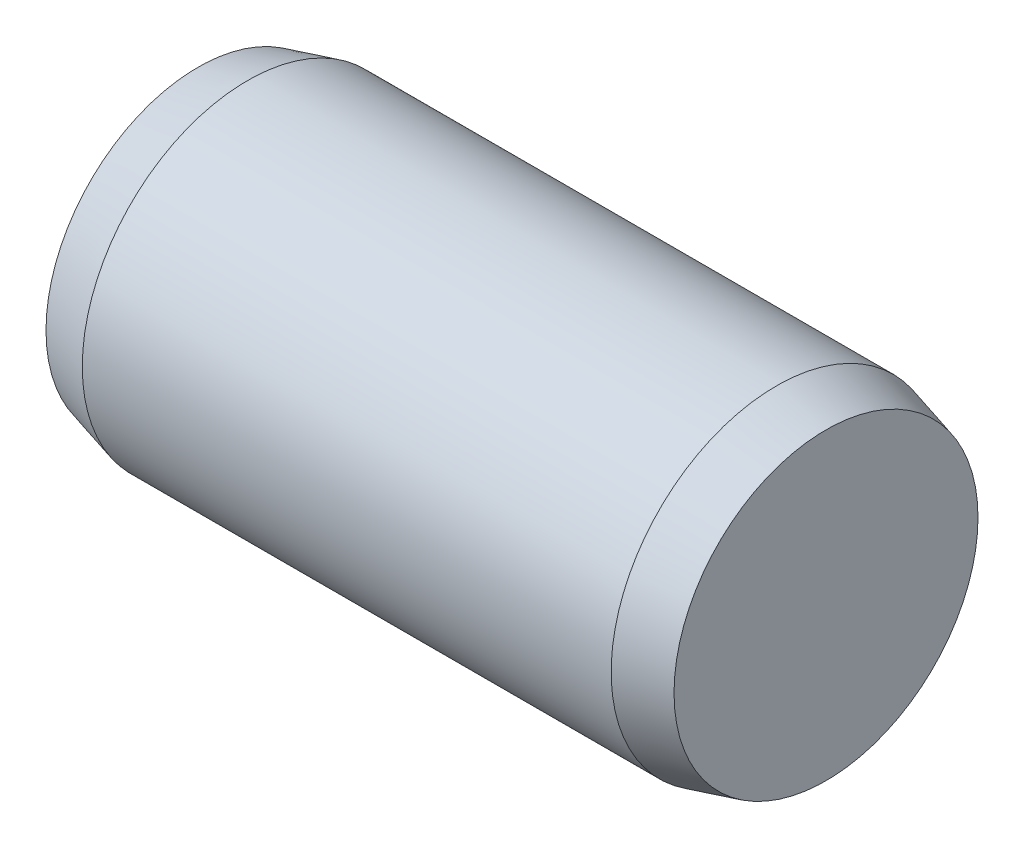
ISO-10303-21;
HEADER;
FILE_DESCRIPTION(('STEP AP214'),'2;1');
FILE_NAME('part.step','',(''),(''),'','','');
FILE_SCHEMA(('AUTOMOTIVE_DESIGN { 1 0 10303 214 1 1 1 1 }'));
ENDSEC;
DATA;
#1=APPLICATION_CONTEXT('core data for automotive mechanical design processes');
#2=APPLICATION_PROTOCOL_DEFINITION('international standard','automotive_design',2000,#1);
#3=PRODUCT_CONTEXT('',#1,'mechanical');
#4=PRODUCT('Part','Part','',(#3));
#5=PRODUCT_RELATED_PRODUCT_CATEGORY('part','',(#4));
#6=PRODUCT_DEFINITION_FORMATION('','',#4);
#7=PRODUCT_DEFINITION_CONTEXT('part definition',#1,'design');
#8=PRODUCT_DEFINITION('design','',#6,#7);
#9=PRODUCT_DEFINITION_SHAPE('','',#8);
#10=(LENGTH_UNIT() NAMED_UNIT(*) SI_UNIT(.MILLI.,.METRE.));
#11=(NAMED_UNIT(*) PLANE_ANGLE_UNIT() SI_UNIT($,.RADIAN.));
#12=(NAMED_UNIT(*) SI_UNIT($,.STERADIAN.) SOLID_ANGLE_UNIT());
#13=UNCERTAINTY_MEASURE_WITH_UNIT(LENGTH_MEASURE(1.E-05),#10,'distance_accuracy_value','');
#14=(GEOMETRIC_REPRESENTATION_CONTEXT(3) GLOBAL_UNCERTAINTY_ASSIGNED_CONTEXT((#13)) GLOBAL_UNIT_ASSIGNED_CONTEXT((#10,
#11,#12)) REPRESENTATION_CONTEXT('',''));
#15=CARTESIAN_POINT('',(0.,0.,0.));
#16=DIRECTION('',(0.,0.,1.));
#17=DIRECTION('',(1.,0.,0.));
#18=AXIS2_PLACEMENT_3D('',#15,#16,#17);
#19=CARTESIAN_POINT('',(-4.,0.,0.));
#20=DIRECTION('',(1.,0.,0.));
#21=DIRECTION('',(0.,0.,-1.));
#22=AXIS2_PLACEMENT_3D('',#19,#20,#21);
#23=CYLINDRICAL_SURFACE('',#22,2.5);
#24=CARTESIAN_POINT('',(-4.,0.,0.));
#25=DIRECTION('',(-1.,0.,0.));
#26=DIRECTION('',(0.,0.,1.));
#27=AXIS2_PLACEMENT_3D('',#24,#25,#26);
#28=CIRCLE('',#27,2.5);
#29=CARTESIAN_POINT('',(-4.,0.,2.5));
#30=VERTEX_POINT('',#29);
#31=EDGE_CURVE('E44',#30,#30,#28,.T.);
#32=ORIENTED_EDGE('',*,*,#31,.F.);
#33=EDGE_LOOP('',(#32));
#34=FACE_BOUND('',#33,.T.);
#35=CARTESIAN_POINT('',(4.,0.,0.));
#36=DIRECTION('',(1.,0.,0.));
#37=DIRECTION('',(0.,0.,-1.));
#38=AXIS2_PLACEMENT_3D('',#35,#36,#37);
#39=CIRCLE('',#38,2.5);
#40=CARTESIAN_POINT('',(4.,0.,-2.5));
#41=VERTEX_POINT('',#40);
#42=EDGE_CURVE('E10',#41,#41,#39,.T.);
#43=ORIENTED_EDGE('',*,*,#42,.F.);
#44=EDGE_LOOP('',(#43));
#45=FACE_BOUND('',#44,.T.);
#46=ADVANCED_FACE('F30',(#34,#45),#23,.T.);
#47=CARTESIAN_POINT('',(4.,0.,0.));
#48=DIRECTION('',(-1.,0.,0.));
#49=DIRECTION('',(0.,0.,-1.));
#50=AXIS2_PLACEMENT_3D('',#47,#48,#49);
#51=CONICAL_SURFACE('',#50,2.5,0.26179938779915);
#52=CARTESIAN_POINT('',(4.75,0.,0.));
#53=DIRECTION('',(1.,0.,0.));
#54=DIRECTION('',(0.,0.,-1.));
#55=AXIS2_PLACEMENT_3D('',#52,#53,#54);
#56=CIRCLE('',#55,2.29903810567666);
#57=CARTESIAN_POINT('',(4.75,0.,-2.29903810567666));
#58=VERTEX_POINT('',#57);
#59=EDGE_CURVE('E36',#58,#58,#56,.T.);
#60=ORIENTED_EDGE('',*,*,#59,.F.);
#61=EDGE_LOOP('',(#60));
#62=FACE_BOUND('',#61,.T.);
#63=ORIENTED_EDGE('',*,*,#42,.T.);
#64=EDGE_LOOP('',(#63));
#65=FACE_BOUND('',#64,.T.);
#66=ADVANCED_FACE('F54',(#62,#65),#51,.T.);
#67=CARTESIAN_POINT('',(4.75,0.,0.));
#68=DIRECTION('',(1.,0.,0.));
#69=DIRECTION('',(0.,0.,-1.));
#70=AXIS2_PLACEMENT_3D('',#67,#68,#69);
#71=PLANE('',#70);
#72=ORIENTED_EDGE('',*,*,#59,.T.);
#73=EDGE_LOOP('',(#72));
#74=FACE_BOUND('',#73,.T.);
#75=ADVANCED_FACE('F58',(#74),#71,.T.);
#76=CARTESIAN_POINT('',(-4.,0.,0.));
#77=DIRECTION('',(1.,0.,0.));
#78=DIRECTION('',(0.,0.,1.));
#79=AXIS2_PLACEMENT_3D('',#76,#77,#78);
#80=CONICAL_SURFACE('',#79,2.5,0.26179938779915);
#81=CARTESIAN_POINT('',(-4.75,0.,0.));
#82=DIRECTION('',(-1.,0.,0.));
#83=DIRECTION('',(0.,0.,1.));
#84=AXIS2_PLACEMENT_3D('',#81,#82,#83);
#85=CIRCLE('',#84,2.29903810567666);
#86=CARTESIAN_POINT('',(-4.75,0.,2.29903810567666));
#87=VERTEX_POINT('',#86);
#88=EDGE_CURVE('E40',#87,#87,#85,.T.);
#89=ORIENTED_EDGE('',*,*,#88,.F.);
#90=EDGE_LOOP('',(#89));
#91=FACE_BOUND('',#90,.T.);
#92=ORIENTED_EDGE('',*,*,#31,.T.);
#93=EDGE_LOOP('',(#92));
#94=FACE_BOUND('',#93,.T.);
#95=ADVANCED_FACE('F50',(#91,#94),#80,.T.);
#96=CARTESIAN_POINT('',(-4.75,0.,0.));
#97=DIRECTION('',(-1.,0.,0.));
#98=DIRECTION('',(0.,0.,1.));
#99=AXIS2_PLACEMENT_3D('',#96,#97,#98);
#100=PLANE('',#99);
#101=ORIENTED_EDGE('',*,*,#88,.T.);
#102=EDGE_LOOP('',(#101));
#103=FACE_BOUND('',#102,.T.);
#104=ADVANCED_FACE('F67',(#103),#100,.T.);
#105=CLOSED_SHELL('',(#46,#66,#75,#95,#104));
#106=MANIFOLD_SOLID_BREP('B2',#105);
#107=ADVANCED_BREP_SHAPE_REPRESENTATION('',(#18,#106),#14);
#108=SHAPE_DEFINITION_REPRESENTATION(#9,#107);
ENDSEC;
END-ISO-10303-21;
